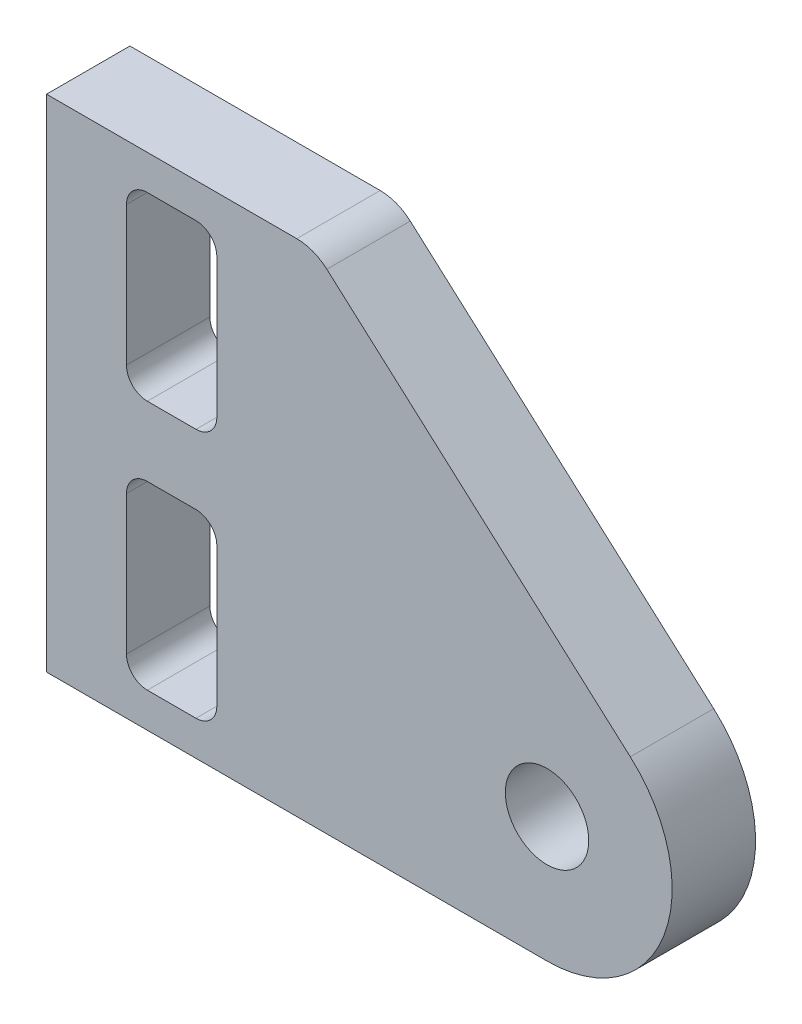
ISO-10303-21;
HEADER;
FILE_DESCRIPTION(('STEP AP214'),'2;1');
FILE_NAME('part.step','',(''),(''),'','','');
FILE_SCHEMA(('AUTOMOTIVE_DESIGN { 1 0 10303 214 1 1 1 1 }'));
ENDSEC;
DATA;
#1=APPLICATION_CONTEXT('core data for automotive mechanical design processes');
#2=APPLICATION_PROTOCOL_DEFINITION('international standard','automotive_design',2000,#1);
#3=PRODUCT_CONTEXT('',#1,'mechanical');
#4=PRODUCT('Part','Part','',(#3));
#5=PRODUCT_RELATED_PRODUCT_CATEGORY('part','',(#4));
#6=PRODUCT_DEFINITION_FORMATION('','',#4);
#7=PRODUCT_DEFINITION_CONTEXT('part definition',#1,'design');
#8=PRODUCT_DEFINITION('design','',#6,#7);
#9=PRODUCT_DEFINITION_SHAPE('','',#8);
#10=(LENGTH_UNIT() NAMED_UNIT(*) SI_UNIT(.MILLI.,.METRE.));
#11=(NAMED_UNIT(*) PLANE_ANGLE_UNIT() SI_UNIT($,.RADIAN.));
#12=(NAMED_UNIT(*) SI_UNIT($,.STERADIAN.) SOLID_ANGLE_UNIT());
#13=UNCERTAINTY_MEASURE_WITH_UNIT(LENGTH_MEASURE(1.E-05),#10,'distance_accuracy_value','');
#14=(GEOMETRIC_REPRESENTATION_CONTEXT(3) GLOBAL_UNCERTAINTY_ASSIGNED_CONTEXT((#13)) GLOBAL_UNIT_ASSIGNED_CONTEXT((#10,
#11,#12)) REPRESENTATION_CONTEXT('',''));
#15=CARTESIAN_POINT('',(0.,0.,0.));
#16=DIRECTION('',(0.,0.,1.));
#17=DIRECTION('',(1.,0.,0.));
#18=AXIS2_PLACEMENT_3D('',#15,#16,#17);
#19=CARTESIAN_POINT('',(201.097853309265,269.1465473352,3.));
#20=DIRECTION('',(0.,0.,1.));
#21=DIRECTION('',(1.,0.,0.));
#22=AXIS2_PLACEMENT_3D('',#19,#20,#21);
#23=PLANE('',#22);
#24=DIRECTION('',(1.,0.,0.));
#25=VECTOR('',#24,1.);
#26=CARTESIAN_POINT('',(186.7228533093,265.8965473352,3.));
#27=LINE('',#26,#25);
#28=CARTESIAN_POINT('',(186.7228533093,265.8965473352,3.));
#29=VERTEX_POINT('',#28);
#30=CARTESIAN_POINT('',(188.4728533093,265.8965473352,3.));
#31=VERTEX_POINT('',#30);
#32=EDGE_CURVE('E249',#29,#31,#27,.T.);
#33=ORIENTED_EDGE('',*,*,#32,.F.);
#34=CARTESIAN_POINT('',(186.7228533093,266.6465473352,3.));
#35=DIRECTION('',(0.,0.,1.));
#36=DIRECTION('',(1.,0.,0.));
#37=AXIS2_PLACEMENT_3D('',#34,#35,#36);
#38=CIRCLE('',#37,0.749999999999987);
#39=CARTESIAN_POINT('',(185.9728533093,266.6465473352,3.));
#40=VERTEX_POINT('',#39);
#41=EDGE_CURVE('E247',#40,#29,#38,.T.);
#42=ORIENTED_EDGE('',*,*,#41,.F.);
#43=DIRECTION('',(0.,-1.,0.));
#44=VECTOR('',#43,1.);
#45=CARTESIAN_POINT('',(185.9728533093,271.6465473352,3.));
#46=LINE('',#45,#44);
#47=CARTESIAN_POINT('',(185.9728533093,271.6465473352,3.));
#48=VERTEX_POINT('',#47);
#49=EDGE_CURVE('E263',#48,#40,#46,.T.);
#50=ORIENTED_EDGE('',*,*,#49,.F.);
#51=CARTESIAN_POINT('',(186.7228533093,271.6465473352,3.));
#52=DIRECTION('',(0.,0.,1.));
#53=DIRECTION('',(1.,0.,0.));
#54=AXIS2_PLACEMENT_3D('',#51,#52,#53);
#55=CIRCLE('',#54,0.750000000000015);
#56=CARTESIAN_POINT('',(186.7228533093,272.3965473352,3.));
#57=VERTEX_POINT('',#56);
#58=EDGE_CURVE('E260',#57,#48,#55,.T.);
#59=ORIENTED_EDGE('',*,*,#58,.F.);
#60=DIRECTION('',(-1.,0.,0.));
#61=VECTOR('',#60,1.);
#62=CARTESIAN_POINT('',(188.4728533093,272.3965473352,3.));
#63=LINE('',#62,#61);
#64=CARTESIAN_POINT('',(188.4728533093,272.3965473352,3.));
#65=VERTEX_POINT('',#64);
#66=EDGE_CURVE('E258',#65,#57,#63,.T.);
#67=ORIENTED_EDGE('',*,*,#66,.F.);
#68=CARTESIAN_POINT('',(188.4728533093,271.6465473352,3.));
#69=DIRECTION('',(0.,0.,1.));
#70=DIRECTION('',(1.,0.,0.));
#71=AXIS2_PLACEMENT_3D('',#68,#69,#70);
#72=CIRCLE('',#71,0.750000000000015);
#73=CARTESIAN_POINT('',(189.2228533093,271.6465473352,3.));
#74=VERTEX_POINT('',#73);
#75=EDGE_CURVE('E256',#74,#65,#72,.T.);
#76=ORIENTED_EDGE('',*,*,#75,.F.);
#77=DIRECTION('',(0.,1.,0.));
#78=VECTOR('',#77,1.);
#79=CARTESIAN_POINT('',(189.2228533093,266.6465473352,3.));
#80=LINE('',#79,#78);
#81=CARTESIAN_POINT('',(189.2228533093,266.6465473352,3.));
#82=VERTEX_POINT('',#81);
#83=EDGE_CURVE('E254',#82,#74,#80,.T.);
#84=ORIENTED_EDGE('',*,*,#83,.F.);
#85=CARTESIAN_POINT('',(188.4728533093,266.6465473352,3.));
#86=DIRECTION('',(0.,0.,1.));
#87=DIRECTION('',(1.,0.,0.));
#88=AXIS2_PLACEMENT_3D('',#85,#86,#87);
#89=CIRCLE('',#88,0.749999999999987);
#90=EDGE_CURVE('E252',#31,#82,#89,.T.);
#91=ORIENTED_EDGE('',*,*,#90,.F.);
#92=EDGE_LOOP('',(#33,#42,#50,#59,#67,#76,#84,#91));
#93=FACE_BOUND('',#92,.T.);
#94=CARTESIAN_POINT('',(201.097853309265,269.1465473352,3.));
#95=DIRECTION('',(0.,0.,1.));
#96=DIRECTION('',(1.,0.,0.));
#97=AXIS2_PLACEMENT_3D('',#94,#95,#96);
#98=CIRCLE('',#97,4.49999999999994);
#99=CARTESIAN_POINT('',(201.0978533093,264.6465473352,3.));
#100=VERTEX_POINT('',#99);
#101=CARTESIAN_POINT('',(204.0923677008,272.5055477161,3.));
#102=VERTEX_POINT('',#101);
#103=EDGE_CURVE('E312',#100,#102,#98,.T.);
#104=ORIENTED_EDGE('',*,*,#103,.T.);
#105=DIRECTION('',(-0.746444529098559,0.665447642552614,0.));
#106=VECTOR('',#105,1.);
#107=CARTESIAN_POINT('',(193.1792057284,282.2345196949,3.));
#108=LINE('',#107,#106);
#109=CARTESIAN_POINT('',(193.1792057284,282.2345196949,3.));
#110=VERTEX_POINT('',#109);
#111=EDGE_CURVE('E315',#102,#110,#108,.T.);
#112=ORIENTED_EDGE('',*,*,#111,.T.);
#113=CARTESIAN_POINT('',(192.097853309156,281.0215473352,3.));
#114=DIRECTION('',(0.,0.,1.));
#115=DIRECTION('',(1.,0.,0.));
#116=AXIS2_PLACEMENT_3D('',#113,#114,#115);
#117=CIRCLE('',#116,1.62499999999999);
#118=CARTESIAN_POINT('',(192.0978533093,282.6465473352,3.));
#119=VERTEX_POINT('',#118);
#120=EDGE_CURVE('E318',#110,#119,#117,.T.);
#121=ORIENTED_EDGE('',*,*,#120,.T.);
#122=DIRECTION('',(-1.,0.,0.));
#123=VECTOR('',#122,1.);
#124=CARTESIAN_POINT('',(192.0978533093,282.6465473352,3.));
#125=LINE('',#124,#123);
#126=CARTESIAN_POINT('',(183.0978533093,282.6465473352,3.));
#127=VERTEX_POINT('',#126);
#128=EDGE_CURVE('E320',#119,#127,#125,.T.);
#129=ORIENTED_EDGE('',*,*,#128,.T.);
#130=DIRECTION('',(0.,-1.,0.));
#131=VECTOR('',#130,1.);
#132=CARTESIAN_POINT('',(183.0978533093,282.6465473352,3.));
#133=LINE('',#132,#131);
#134=CARTESIAN_POINT('',(183.0978533093,264.6465473352,3.));
#135=VERTEX_POINT('',#134);
#136=EDGE_CURVE('E322',#127,#135,#133,.T.);
#137=ORIENTED_EDGE('',*,*,#136,.T.);
#138=DIRECTION('',(1.,0.,0.));
#139=VECTOR('',#138,1.);
#140=CARTESIAN_POINT('',(201.0978533093,264.6465473352,3.));
#141=LINE('',#140,#139);
#142=EDGE_CURVE('E324',#135,#100,#141,.T.);
#143=ORIENTED_EDGE('',*,*,#142,.T.);
#144=EDGE_LOOP('',(#104,#112,#121,#129,#137,#143));
#145=FACE_BOUND('',#144,.T.);
#146=CARTESIAN_POINT('',(201.097853309265,269.1465473352,3.));
#147=DIRECTION('',(0.,0.,1.));
#148=DIRECTION('',(1.,0.,0.));
#149=AXIS2_PLACEMENT_3D('',#146,#147,#148);
#150=CIRCLE('',#149,1.50000000003547);
#151=CARTESIAN_POINT('',(202.5978533093,269.1465473352,3.));
#152=VERTEX_POINT('',#151);
#153=EDGE_CURVE('E306',#152,#152,#150,.T.);
#154=ORIENTED_EDGE('',*,*,#153,.F.);
#155=EDGE_LOOP('',(#154));
#156=FACE_BOUND('',#155,.T.);
#157=DIRECTION('',(1.,0.,0.));
#158=VECTOR('',#157,1.);
#159=CARTESIAN_POINT('',(186.7228533093,274.8959687639,3.));
#160=LINE('',#159,#158);
#161=CARTESIAN_POINT('',(186.7228533093,274.8959687639,3.));
#162=VERTEX_POINT('',#161);
#163=CARTESIAN_POINT('',(188.4728533093,274.8959687639,3.));
#164=VERTEX_POINT('',#163);
#165=EDGE_CURVE('E190',#162,#164,#160,.T.);
#166=ORIENTED_EDGE('',*,*,#165,.F.);
#167=CARTESIAN_POINT('',(186.7228533093,275.6459687639,3.));
#168=DIRECTION('',(0.,0.,1.));
#169=DIRECTION('',(1.,0.,0.));
#170=AXIS2_PLACEMENT_3D('',#167,#168,#169);
#171=CIRCLE('',#170,0.750000000000015);
#172=CARTESIAN_POINT('',(185.9728533093,275.6459687639,3.));
#173=VERTEX_POINT('',#172);
#174=EDGE_CURVE('E182',#173,#162,#171,.T.);
#175=ORIENTED_EDGE('',*,*,#174,.F.);
#176=DIRECTION('',(0.,-1.,0.));
#177=VECTOR('',#176,1.);
#178=CARTESIAN_POINT('',(185.9728533093,280.6459687639,3.));
#179=LINE('',#178,#177);
#180=CARTESIAN_POINT('',(185.9728533093,280.6459687639,3.));
#181=VERTEX_POINT('',#180);
#182=EDGE_CURVE('E215',#181,#173,#179,.T.);
#183=ORIENTED_EDGE('',*,*,#182,.F.);
#184=CARTESIAN_POINT('',(186.7228533093,280.6459687639,3.));
#185=DIRECTION('',(0.,0.,1.));
#186=DIRECTION('',(1.,0.,0.));
#187=AXIS2_PLACEMENT_3D('',#184,#185,#186);
#188=CIRCLE('',#187,0.750000000000015);
#189=CARTESIAN_POINT('',(186.7228533093,281.3959687639,3.));
#190=VERTEX_POINT('',#189);
#191=EDGE_CURVE('E213',#190,#181,#188,.T.);
#192=ORIENTED_EDGE('',*,*,#191,.F.);
#193=DIRECTION('',(-1.,0.,0.));
#194=VECTOR('',#193,1.);
#195=CARTESIAN_POINT('',(188.4728533093,281.3959687639,3.));
#196=LINE('',#195,#194);
#197=CARTESIAN_POINT('',(188.4728533093,281.3959687639,3.));
#198=VERTEX_POINT('',#197);
#199=EDGE_CURVE('E211',#198,#190,#196,.T.);
#200=ORIENTED_EDGE('',*,*,#199,.F.);
#201=CARTESIAN_POINT('',(188.4728533093,280.6459687639,3.));
#202=DIRECTION('',(0.,0.,1.));
#203=DIRECTION('',(1.,0.,0.));
#204=AXIS2_PLACEMENT_3D('',#201,#202,#203);
#205=CIRCLE('',#204,0.750000000000015);
#206=CARTESIAN_POINT('',(189.2228533093,280.6459687639,3.));
#207=VERTEX_POINT('',#206);
#208=EDGE_CURVE('E209',#207,#198,#205,.T.);
#209=ORIENTED_EDGE('',*,*,#208,.F.);
#210=DIRECTION('',(0.,1.,0.));
#211=VECTOR('',#210,1.);
#212=CARTESIAN_POINT('',(189.2228533093,275.6459687639,3.));
#213=LINE('',#212,#211);
#214=CARTESIAN_POINT('',(189.2228533093,275.6459687639,3.));
#215=VERTEX_POINT('',#214);
#216=EDGE_CURVE('E205',#215,#207,#213,.T.);
#217=ORIENTED_EDGE('',*,*,#216,.F.);
#218=CARTESIAN_POINT('',(188.4728533093,275.6459687639,3.));
#219=DIRECTION('',(0.,0.,1.));
#220=DIRECTION('',(1.,0.,0.));
#221=AXIS2_PLACEMENT_3D('',#218,#219,#220);
#222=CIRCLE('',#221,0.750000000000015);
#223=EDGE_CURVE('E203',#164,#215,#222,.T.);
#224=ORIENTED_EDGE('',*,*,#223,.F.);
#225=EDGE_LOOP('',(#166,#175,#183,#192,#200,#209,#217,#224));
#226=FACE_BOUND('',#225,.T.);
#227=ADVANCED_FACE('F33',(#93,#145,#156,#226),#23,.T.);
#228=CARTESIAN_POINT('',(201.097853309265,269.1465473352,0.));
#229=DIRECTION('',(0.,0.,1.));
#230=DIRECTION('',(1.,0.,0.));
#231=AXIS2_PLACEMENT_3D('',#228,#229,#230);
#232=PLANE('',#231);
#233=CARTESIAN_POINT('',(186.7228533093,266.6465473352,0.));
#234=DIRECTION('',(0.,0.,1.));
#235=DIRECTION('',(1.,0.,0.));
#236=AXIS2_PLACEMENT_3D('',#233,#234,#235);
#237=CIRCLE('',#236,0.749999999999987);
#238=CARTESIAN_POINT('',(185.9728533093,266.6465473352,0.));
#239=VERTEX_POINT('',#238);
#240=CARTESIAN_POINT('',(186.7228533093,265.8965473352,0.));
#241=VERTEX_POINT('',#240);
#242=EDGE_CURVE('E198',#239,#241,#237,.T.);
#243=ORIENTED_EDGE('',*,*,#242,.T.);
#244=DIRECTION('',(1.,0.,0.));
#245=VECTOR('',#244,1.);
#246=CARTESIAN_POINT('',(186.7228533093,265.8965473352,0.));
#247=LINE('',#246,#245);
#248=CARTESIAN_POINT('',(188.4728533093,265.8965473352,0.));
#249=VERTEX_POINT('',#248);
#250=EDGE_CURVE('E268',#241,#249,#247,.T.);
#251=ORIENTED_EDGE('',*,*,#250,.T.);
#252=CARTESIAN_POINT('',(188.4728533093,266.6465473352,0.));
#253=DIRECTION('',(0.,0.,1.));
#254=DIRECTION('',(1.,0.,0.));
#255=AXIS2_PLACEMENT_3D('',#252,#253,#254);
#256=CIRCLE('',#255,0.749999999999987);
#257=CARTESIAN_POINT('',(189.2228533093,266.6465473352,0.));
#258=VERTEX_POINT('',#257);
#259=EDGE_CURVE('E271',#249,#258,#256,.T.);
#260=ORIENTED_EDGE('',*,*,#259,.T.);
#261=DIRECTION('',(0.,1.,0.));
#262=VECTOR('',#261,1.);
#263=CARTESIAN_POINT('',(189.2228533093,266.6465473352,0.));
#264=LINE('',#263,#262);
#265=CARTESIAN_POINT('',(189.2228533093,271.6465473352,0.));
#266=VERTEX_POINT('',#265);
#267=EDGE_CURVE('E274',#258,#266,#264,.T.);
#268=ORIENTED_EDGE('',*,*,#267,.T.);
#269=CARTESIAN_POINT('',(188.4728533093,271.6465473352,0.));
#270=DIRECTION('',(0.,0.,1.));
#271=DIRECTION('',(1.,0.,0.));
#272=AXIS2_PLACEMENT_3D('',#269,#270,#271);
#273=CIRCLE('',#272,0.750000000000015);
#274=CARTESIAN_POINT('',(188.4728533093,272.3965473352,0.));
#275=VERTEX_POINT('',#274);
#276=EDGE_CURVE('E277',#266,#275,#273,.T.);
#277=ORIENTED_EDGE('',*,*,#276,.T.);
#278=DIRECTION('',(-1.,0.,0.));
#279=VECTOR('',#278,1.);
#280=CARTESIAN_POINT('',(188.4728533093,272.3965473352,0.));
#281=LINE('',#280,#279);
#282=CARTESIAN_POINT('',(186.7228533093,272.3965473352,0.));
#283=VERTEX_POINT('',#282);
#284=EDGE_CURVE('E280',#275,#283,#281,.T.);
#285=ORIENTED_EDGE('',*,*,#284,.T.);
#286=CARTESIAN_POINT('',(186.7228533093,271.6465473352,0.));
#287=DIRECTION('',(0.,0.,1.));
#288=DIRECTION('',(1.,0.,0.));
#289=AXIS2_PLACEMENT_3D('',#286,#287,#288);
#290=CIRCLE('',#289,0.750000000000015);
#291=CARTESIAN_POINT('',(185.9728533093,271.6465473352,0.));
#292=VERTEX_POINT('',#291);
#293=EDGE_CURVE('E283',#283,#292,#290,.T.);
#294=ORIENTED_EDGE('',*,*,#293,.T.);
#295=DIRECTION('',(0.,-1.,0.));
#296=VECTOR('',#295,1.);
#297=CARTESIAN_POINT('',(185.9728533093,271.6465473352,0.));
#298=LINE('',#297,#296);
#299=EDGE_CURVE('E250',#292,#239,#298,.T.);
#300=ORIENTED_EDGE('',*,*,#299,.T.);
#301=EDGE_LOOP('',(#243,#251,#260,#268,#277,#285,#294,#300));
#302=FACE_BOUND('',#301,.T.);
#303=CARTESIAN_POINT('',(201.097853309265,269.1465473352,0.));
#304=DIRECTION('',(0.,0.,1.));
#305=DIRECTION('',(1.,0.,0.));
#306=AXIS2_PLACEMENT_3D('',#303,#304,#305);
#307=CIRCLE('',#306,4.49999999999994);
#308=CARTESIAN_POINT('',(201.0978533093,264.6465473352,0.));
#309=VERTEX_POINT('',#308);
#310=CARTESIAN_POINT('',(204.0923677008,272.5055477161,0.));
#311=VERTEX_POINT('',#310);
#312=EDGE_CURVE('E309',#309,#311,#307,.T.);
#313=ORIENTED_EDGE('',*,*,#312,.F.);
#314=DIRECTION('',(1.,0.,0.));
#315=VECTOR('',#314,1.);
#316=CARTESIAN_POINT('',(201.0978533093,264.6465473352,0.));
#317=LINE('',#316,#315);
#318=CARTESIAN_POINT('',(183.0978533093,264.6465473352,0.));
#319=VERTEX_POINT('',#318);
#320=EDGE_CURVE('E316',#319,#309,#317,.T.);
#321=ORIENTED_EDGE('',*,*,#320,.F.);
#322=DIRECTION('',(0.,-1.,0.));
#323=VECTOR('',#322,1.);
#324=CARTESIAN_POINT('',(183.0978533093,282.6465473352,0.));
#325=LINE('',#324,#323);
#326=CARTESIAN_POINT('',(183.0978533093,282.6465473352,0.));
#327=VERTEX_POINT('',#326);
#328=EDGE_CURVE('E335',#327,#319,#325,.T.);
#329=ORIENTED_EDGE('',*,*,#328,.F.);
#330=DIRECTION('',(-1.,0.,0.));
#331=VECTOR('',#330,1.);
#332=CARTESIAN_POINT('',(192.0978533093,282.6465473352,0.));
#333=LINE('',#332,#331);
#334=CARTESIAN_POINT('',(192.0978533093,282.6465473352,0.));
#335=VERTEX_POINT('',#334);
#336=EDGE_CURVE('E333',#335,#327,#333,.T.);
#337=ORIENTED_EDGE('',*,*,#336,.F.);
#338=CARTESIAN_POINT('',(192.097853309156,281.0215473352,0.));
#339=DIRECTION('',(0.,0.,1.));
#340=DIRECTION('',(1.,0.,0.));
#341=AXIS2_PLACEMENT_3D('',#338,#339,#340);
#342=CIRCLE('',#341,1.62499999999999);
#343=CARTESIAN_POINT('',(193.1792057284,282.2345196949,0.));
#344=VERTEX_POINT('',#343);
#345=EDGE_CURVE('E331',#344,#335,#342,.T.);
#346=ORIENTED_EDGE('',*,*,#345,.F.);
#347=DIRECTION('',(-0.746444529098559,0.665447642552614,0.));
#348=VECTOR('',#347,1.);
#349=CARTESIAN_POINT('',(193.1792057284,282.2345196949,0.));
#350=LINE('',#349,#348);
#351=EDGE_CURVE('E329',#311,#344,#350,.T.);
#352=ORIENTED_EDGE('',*,*,#351,.F.);
#353=EDGE_LOOP('',(#313,#321,#329,#337,#346,#352));
#354=FACE_BOUND('',#353,.T.);
#355=CARTESIAN_POINT('',(201.097853309265,269.1465473352,0.));
#356=DIRECTION('',(0.,0.,1.));
#357=DIRECTION('',(1.,0.,0.));
#358=AXIS2_PLACEMENT_3D('',#355,#356,#357);
#359=CIRCLE('',#358,1.50000000003547);
#360=CARTESIAN_POINT('',(202.5978533093,269.1465473352,0.));
#361=VERTEX_POINT('',#360);
#362=EDGE_CURVE('E305',#361,#361,#359,.T.);
#363=ORIENTED_EDGE('',*,*,#362,.T.);
#364=EDGE_LOOP('',(#363));
#365=FACE_BOUND('',#364,.T.);
#366=CARTESIAN_POINT('',(186.7228533093,275.6459687639,0.));
#367=DIRECTION('',(0.,0.,1.));
#368=DIRECTION('',(1.,0.,0.));
#369=AXIS2_PLACEMENT_3D('',#366,#367,#368);
#370=CIRCLE('',#369,0.750000000000015);
#371=CARTESIAN_POINT('',(185.9728533093,275.6459687639,0.));
#372=VERTEX_POINT('',#371);
#373=CARTESIAN_POINT('',(186.7228533093,274.8959687639,0.));
#374=VERTEX_POINT('',#373);
#375=EDGE_CURVE('E56',#372,#374,#370,.T.);
#376=ORIENTED_EDGE('',*,*,#375,.T.);
#377=DIRECTION('',(1.,0.,0.));
#378=VECTOR('',#377,1.);
#379=CARTESIAN_POINT('',(186.7228533093,274.8959687639,0.));
#380=LINE('',#379,#378);
#381=CARTESIAN_POINT('',(188.4728533093,274.8959687639,0.));
#382=VERTEX_POINT('',#381);
#383=EDGE_CURVE('E197',#374,#382,#380,.T.);
#384=ORIENTED_EDGE('',*,*,#383,.T.);
#385=CARTESIAN_POINT('',(188.4728533093,275.6459687639,0.));
#386=DIRECTION('',(0.,0.,1.));
#387=DIRECTION('',(1.,0.,0.));
#388=AXIS2_PLACEMENT_3D('',#385,#386,#387);
#389=CIRCLE('',#388,0.750000000000015);
#390=CARTESIAN_POINT('',(189.2228533093,275.6459687639,0.));
#391=VERTEX_POINT('',#390);
#392=EDGE_CURVE('E219',#382,#391,#389,.T.);
#393=ORIENTED_EDGE('',*,*,#392,.T.);
#394=DIRECTION('',(0.,1.,0.));
#395=VECTOR('',#394,1.);
#396=CARTESIAN_POINT('',(189.2228533093,275.6459687639,0.));
#397=LINE('',#396,#395);
#398=CARTESIAN_POINT('',(189.2228533093,280.6459687639,0.));
#399=VERTEX_POINT('',#398);
#400=EDGE_CURVE('E222',#391,#399,#397,.T.);
#401=ORIENTED_EDGE('',*,*,#400,.T.);
#402=CARTESIAN_POINT('',(188.4728533093,280.6459687639,0.));
#403=DIRECTION('',(0.,0.,1.));
#404=DIRECTION('',(1.,0.,0.));
#405=AXIS2_PLACEMENT_3D('',#402,#403,#404);
#406=CIRCLE('',#405,0.750000000000015);
#407=CARTESIAN_POINT('',(188.4728533093,281.3959687639,0.));
#408=VERTEX_POINT('',#407);
#409=EDGE_CURVE('E225',#399,#408,#406,.T.);
#410=ORIENTED_EDGE('',*,*,#409,.T.);
#411=DIRECTION('',(-1.,0.,0.));
#412=VECTOR('',#411,1.);
#413=CARTESIAN_POINT('',(188.4728533093,281.3959687639,0.));
#414=LINE('',#413,#412);
#415=CARTESIAN_POINT('',(186.7228533093,281.3959687639,0.));
#416=VERTEX_POINT('',#415);
#417=EDGE_CURVE('E228',#408,#416,#414,.T.);
#418=ORIENTED_EDGE('',*,*,#417,.T.);
#419=CARTESIAN_POINT('',(186.7228533093,280.6459687639,0.));
#420=DIRECTION('',(0.,0.,1.));
#421=DIRECTION('',(1.,0.,0.));
#422=AXIS2_PLACEMENT_3D('',#419,#420,#421);
#423=CIRCLE('',#422,0.750000000000015);
#424=CARTESIAN_POINT('',(185.9728533093,280.6459687639,0.));
#425=VERTEX_POINT('',#424);
#426=EDGE_CURVE('E231',#416,#425,#423,.T.);
#427=ORIENTED_EDGE('',*,*,#426,.T.);
#428=DIRECTION('',(0.,-1.,0.));
#429=VECTOR('',#428,1.);
#430=CARTESIAN_POINT('',(185.9728533093,280.6459687639,0.));
#431=LINE('',#430,#429);
#432=EDGE_CURVE('E191',#425,#372,#431,.T.);
#433=ORIENTED_EDGE('',*,*,#432,.T.);
#434=EDGE_LOOP('',(#376,#384,#393,#401,#410,#418,#427,#433));
#435=FACE_BOUND('',#434,.T.);
#436=ADVANCED_FACE('F359',(#302,#354,#365,#435),#232,.F.);
#437=CARTESIAN_POINT('',(201.097853309265,269.1465473352,3.));
#438=DIRECTION('',(0.,0.,-1.));
#439=DIRECTION('',(-1.,0.,0.));
#440=AXIS2_PLACEMENT_3D('',#437,#438,#439);
#441=CYLINDRICAL_SURFACE('',#440,4.49999999999994);
#442=ORIENTED_EDGE('',*,*,#312,.T.);
#443=DIRECTION('',(0.,0.,-1.));
#444=VECTOR('',#443,1.);
#445=CARTESIAN_POINT('',(204.0923677008,272.5055477161,3.));
#446=LINE('',#445,#444);
#447=EDGE_CURVE('E11',#102,#311,#446,.T.);
#448=ORIENTED_EDGE('',*,*,#447,.F.);
#449=ORIENTED_EDGE('',*,*,#103,.F.);
#450=DIRECTION('',(0.,0.,-1.));
#451=VECTOR('',#450,1.);
#452=CARTESIAN_POINT('',(201.0978533093,264.6465473352,3.));
#453=LINE('',#452,#451);
#454=EDGE_CURVE('E326',#100,#309,#453,.T.);
#455=ORIENTED_EDGE('',*,*,#454,.T.);
#456=EDGE_LOOP('',(#442,#448,#449,#455));
#457=FACE_BOUND('',#456,.T.);
#458=ADVANCED_FACE('F35',(#457),#441,.T.);
#459=CARTESIAN_POINT('',(193.1792057284,282.2345196949,3.));
#460=DIRECTION('',(-0.665447642552613,-0.746444529098559,0.));
#461=DIRECTION('',(0.746444529098559,-0.665447642552614,0.));
#462=AXIS2_PLACEMENT_3D('',#459,#460,#461);
#463=PLANE('',#462);
#464=ORIENTED_EDGE('',*,*,#351,.T.);
#465=DIRECTION('',(0.,0.,-1.));
#466=VECTOR('',#465,1.);
#467=CARTESIAN_POINT('',(193.1792057284,282.2345196949,3.));
#468=LINE('',#467,#466);
#469=EDGE_CURVE('E41',#110,#344,#468,.T.);
#470=ORIENTED_EDGE('',*,*,#469,.F.);
#471=ORIENTED_EDGE('',*,*,#111,.F.);
#472=ORIENTED_EDGE('',*,*,#447,.T.);
#473=EDGE_LOOP('',(#464,#470,#471,#472));
#474=FACE_BOUND('',#473,.T.);
#475=ADVANCED_FACE('F377',(#474),#463,.F.);
#476=CARTESIAN_POINT('',(192.097853309156,281.0215473352,3.));
#477=DIRECTION('',(0.,0.,-1.));
#478=DIRECTION('',(-1.,0.,0.));
#479=AXIS2_PLACEMENT_3D('',#476,#477,#478);
#480=CYLINDRICAL_SURFACE('',#479,1.62499999999999);
#481=ORIENTED_EDGE('',*,*,#345,.T.);
#482=DIRECTION('',(0.,0.,-1.));
#483=VECTOR('',#482,1.);
#484=CARTESIAN_POINT('',(192.0978533093,282.6465473352,3.));
#485=LINE('',#484,#483);
#486=EDGE_CURVE('E346',#119,#335,#485,.T.);
#487=ORIENTED_EDGE('',*,*,#486,.F.);
#488=ORIENTED_EDGE('',*,*,#120,.F.);
#489=ORIENTED_EDGE('',*,*,#469,.T.);
#490=EDGE_LOOP('',(#481,#487,#488,#489));
#491=FACE_BOUND('',#490,.T.);
#492=ADVANCED_FACE('F353',(#491),#480,.T.);
#493=CARTESIAN_POINT('',(192.0978533093,282.6465473352,3.));
#494=DIRECTION('',(0.,-1.,0.));
#495=DIRECTION('',(0.,0.,-1.));
#496=AXIS2_PLACEMENT_3D('',#493,#494,#495);
#497=PLANE('',#496);
#498=ORIENTED_EDGE('',*,*,#336,.T.);
#499=DIRECTION('',(0.,0.,-1.));
#500=VECTOR('',#499,1.);
#501=CARTESIAN_POINT('',(183.0978533093,282.6465473352,3.));
#502=LINE('',#501,#500);
#503=EDGE_CURVE('E343',#127,#327,#502,.T.);
#504=ORIENTED_EDGE('',*,*,#503,.F.);
#505=ORIENTED_EDGE('',*,*,#128,.F.);
#506=ORIENTED_EDGE('',*,*,#486,.T.);
#507=EDGE_LOOP('',(#498,#504,#505,#506));
#508=FACE_BOUND('',#507,.T.);
#509=ADVANCED_FACE('F365',(#508),#497,.F.);
#510=CARTESIAN_POINT('',(183.0978533093,282.6465473352,3.));
#511=DIRECTION('',(1.,0.,0.));
#512=DIRECTION('',(0.,0.,-1.));
#513=AXIS2_PLACEMENT_3D('',#510,#511,#512);
#514=PLANE('',#513);
#515=ORIENTED_EDGE('',*,*,#328,.T.);
#516=DIRECTION('',(0.,0.,-1.));
#517=VECTOR('',#516,1.);
#518=CARTESIAN_POINT('',(183.0978533093,264.6465473352,3.));
#519=LINE('',#518,#517);
#520=EDGE_CURVE('E340',#135,#319,#519,.T.);
#521=ORIENTED_EDGE('',*,*,#520,.F.);
#522=ORIENTED_EDGE('',*,*,#136,.F.);
#523=ORIENTED_EDGE('',*,*,#503,.T.);
#524=EDGE_LOOP('',(#515,#521,#522,#523));
#525=FACE_BOUND('',#524,.T.);
#526=ADVANCED_FACE('F369',(#525),#514,.F.);
#527=CARTESIAN_POINT('',(201.0978533093,264.6465473352,3.));
#528=DIRECTION('',(0.,1.,0.));
#529=DIRECTION('',(0.,0.,1.));
#530=AXIS2_PLACEMENT_3D('',#527,#528,#529);
#531=PLANE('',#530);
#532=ORIENTED_EDGE('',*,*,#320,.T.);
#533=ORIENTED_EDGE('',*,*,#454,.F.);
#534=ORIENTED_EDGE('',*,*,#142,.F.);
#535=ORIENTED_EDGE('',*,*,#520,.T.);
#536=EDGE_LOOP('',(#532,#533,#534,#535));
#537=FACE_BOUND('',#536,.T.);
#538=ADVANCED_FACE('F380',(#537),#531,.F.);
#539=CARTESIAN_POINT('',(201.097853309265,269.1465473352,3.));
#540=DIRECTION('',(0.,0.,-1.));
#541=DIRECTION('',(-1.,0.,0.));
#542=AXIS2_PLACEMENT_3D('',#539,#540,#541);
#543=CYLINDRICAL_SURFACE('',#542,1.50000000003547);
#544=ORIENTED_EDGE('',*,*,#153,.T.);
#545=EDGE_LOOP('',(#544));
#546=FACE_BOUND('',#545,.T.);
#547=ORIENTED_EDGE('',*,*,#362,.F.);
#548=EDGE_LOOP('',(#547));
#549=FACE_BOUND('',#548,.T.);
#550=ADVANCED_FACE('F382',(#546,#549),#543,.F.);
#551=CARTESIAN_POINT('',(186.7228533093,266.6465473352,3.));
#552=DIRECTION('',(0.,0.,-1.));
#553=DIRECTION('',(-1.,0.,0.));
#554=AXIS2_PLACEMENT_3D('',#551,#552,#553);
#555=CYLINDRICAL_SURFACE('',#554,0.749999999999987);
#556=ORIENTED_EDGE('',*,*,#242,.F.);
#557=DIRECTION('',(0.,0.,-1.));
#558=VECTOR('',#557,1.);
#559=CARTESIAN_POINT('',(185.9728533093,266.6465473352,3.));
#560=LINE('',#559,#558);
#561=EDGE_CURVE('E265',#40,#239,#560,.T.);
#562=ORIENTED_EDGE('',*,*,#561,.F.);
#563=ORIENTED_EDGE('',*,*,#41,.T.);
#564=DIRECTION('',(0.,0.,-1.));
#565=VECTOR('',#564,1.);
#566=CARTESIAN_POINT('',(186.7228533093,265.8965473352,3.));
#567=LINE('',#566,#565);
#568=EDGE_CURVE('E302',#29,#241,#567,.T.);
#569=ORIENTED_EDGE('',*,*,#568,.T.);
#570=EDGE_LOOP('',(#556,#562,#563,#569));
#571=FACE_BOUND('',#570,.T.);
#572=ADVANCED_FACE('F388',(#571),#555,.F.);
#573=CARTESIAN_POINT('',(186.7228533093,265.8965473352,3.));
#574=DIRECTION('',(0.,1.,0.));
#575=DIRECTION('',(0.,0.,1.));
#576=AXIS2_PLACEMENT_3D('',#573,#574,#575);
#577=PLANE('',#576);
#578=ORIENTED_EDGE('',*,*,#250,.F.);
#579=ORIENTED_EDGE('',*,*,#568,.F.);
#580=ORIENTED_EDGE('',*,*,#32,.T.);
#581=DIRECTION('',(0.,0.,-1.));
#582=VECTOR('',#581,1.);
#583=CARTESIAN_POINT('',(188.4728533093,265.8965473352,3.));
#584=LINE('',#583,#582);
#585=EDGE_CURVE('E300',#31,#249,#584,.T.);
#586=ORIENTED_EDGE('',*,*,#585,.T.);
#587=EDGE_LOOP('',(#578,#579,#580,#586));
#588=FACE_BOUND('',#587,.T.);
#589=ADVANCED_FACE('F404',(#588),#577,.T.);
#590=CARTESIAN_POINT('',(188.4728533093,266.6465473352,3.));
#591=DIRECTION('',(0.,0.,-1.));
#592=DIRECTION('',(-1.,0.,0.));
#593=AXIS2_PLACEMENT_3D('',#590,#591,#592);
#594=CYLINDRICAL_SURFACE('',#593,0.749999999999987);
#595=ORIENTED_EDGE('',*,*,#259,.F.);
#596=ORIENTED_EDGE('',*,*,#585,.F.);
#597=ORIENTED_EDGE('',*,*,#90,.T.);
#598=DIRECTION('',(0.,0.,-1.));
#599=VECTOR('',#598,1.);
#600=CARTESIAN_POINT('',(189.2228533093,266.6465473352,3.));
#601=LINE('',#600,#599);
#602=EDGE_CURVE('E298',#82,#258,#601,.T.);
#603=ORIENTED_EDGE('',*,*,#602,.T.);
#604=EDGE_LOOP('',(#595,#596,#597,#603));
#605=FACE_BOUND('',#604,.T.);
#606=ADVANCED_FACE('F408',(#605),#594,.F.);
#607=CARTESIAN_POINT('',(189.2228533093,266.6465473352,3.));
#608=DIRECTION('',(-1.,0.,0.));
#609=DIRECTION('',(0.,0.,1.));
#610=AXIS2_PLACEMENT_3D('',#607,#608,#609);
#611=PLANE('',#610);
#612=ORIENTED_EDGE('',*,*,#267,.F.);
#613=ORIENTED_EDGE('',*,*,#602,.F.);
#614=ORIENTED_EDGE('',*,*,#83,.T.);
#615=DIRECTION('',(0.,0.,-1.));
#616=VECTOR('',#615,1.);
#617=CARTESIAN_POINT('',(189.2228533093,271.6465473352,3.));
#618=LINE('',#617,#616);
#619=EDGE_CURVE('E296',#74,#266,#618,.T.);
#620=ORIENTED_EDGE('',*,*,#619,.T.);
#621=EDGE_LOOP('',(#612,#613,#614,#620));
#622=FACE_BOUND('',#621,.T.);
#623=ADVANCED_FACE('F412',(#622),#611,.T.);
#624=CARTESIAN_POINT('',(188.4728533093,271.6465473352,3.));
#625=DIRECTION('',(0.,0.,-1.));
#626=DIRECTION('',(-1.,0.,0.));
#627=AXIS2_PLACEMENT_3D('',#624,#625,#626);
#628=CYLINDRICAL_SURFACE('',#627,0.750000000000015);
#629=ORIENTED_EDGE('',*,*,#276,.F.);
#630=ORIENTED_EDGE('',*,*,#619,.F.);
#631=ORIENTED_EDGE('',*,*,#75,.T.);
#632=DIRECTION('',(0.,0.,-1.));
#633=VECTOR('',#632,1.);
#634=CARTESIAN_POINT('',(188.4728533093,272.3965473352,3.));
#635=LINE('',#634,#633);
#636=EDGE_CURVE('E294',#65,#275,#635,.T.);
#637=ORIENTED_EDGE('',*,*,#636,.T.);
#638=EDGE_LOOP('',(#629,#630,#631,#637));
#639=FACE_BOUND('',#638,.T.);
#640=ADVANCED_FACE('F416',(#639),#628,.F.);
#641=CARTESIAN_POINT('',(188.4728533093,272.3965473352,3.));
#642=DIRECTION('',(0.,-1.,0.));
#643=DIRECTION('',(0.,0.,-1.));
#644=AXIS2_PLACEMENT_3D('',#641,#642,#643);
#645=PLANE('',#644);
#646=ORIENTED_EDGE('',*,*,#284,.F.);
#647=ORIENTED_EDGE('',*,*,#636,.F.);
#648=ORIENTED_EDGE('',*,*,#66,.T.);
#649=DIRECTION('',(0.,0.,-1.));
#650=VECTOR('',#649,1.);
#651=CARTESIAN_POINT('',(186.7228533093,272.3965473352,3.));
#652=LINE('',#651,#650);
#653=EDGE_CURVE('E292',#57,#283,#652,.T.);
#654=ORIENTED_EDGE('',*,*,#653,.T.);
#655=EDGE_LOOP('',(#646,#647,#648,#654));
#656=FACE_BOUND('',#655,.T.);
#657=ADVANCED_FACE('F420',(#656),#645,.T.);
#658=CARTESIAN_POINT('',(186.7228533093,271.6465473352,3.));
#659=DIRECTION('',(0.,0.,-1.));
#660=DIRECTION('',(-1.,0.,0.));
#661=AXIS2_PLACEMENT_3D('',#658,#659,#660);
#662=CYLINDRICAL_SURFACE('',#661,0.750000000000015);
#663=ORIENTED_EDGE('',*,*,#293,.F.);
#664=ORIENTED_EDGE('',*,*,#653,.F.);
#665=ORIENTED_EDGE('',*,*,#58,.T.);
#666=DIRECTION('',(0.,0.,-1.));
#667=VECTOR('',#666,1.);
#668=CARTESIAN_POINT('',(185.9728533093,271.6465473352,3.));
#669=LINE('',#668,#667);
#670=EDGE_CURVE('E290',#48,#292,#669,.T.);
#671=ORIENTED_EDGE('',*,*,#670,.T.);
#672=EDGE_LOOP('',(#663,#664,#665,#671));
#673=FACE_BOUND('',#672,.T.);
#674=ADVANCED_FACE('F424',(#673),#662,.F.);
#675=CARTESIAN_POINT('',(185.9728533093,271.6465473352,3.));
#676=DIRECTION('',(1.,0.,0.));
#677=DIRECTION('',(0.,0.,-1.));
#678=AXIS2_PLACEMENT_3D('',#675,#676,#677);
#679=PLANE('',#678);
#680=ORIENTED_EDGE('',*,*,#299,.F.);
#681=ORIENTED_EDGE('',*,*,#670,.F.);
#682=ORIENTED_EDGE('',*,*,#49,.T.);
#683=ORIENTED_EDGE('',*,*,#561,.T.);
#684=EDGE_LOOP('',(#680,#681,#682,#683));
#685=FACE_BOUND('',#684,.T.);
#686=ADVANCED_FACE('F428',(#685),#679,.T.);
#687=CARTESIAN_POINT('',(186.7228533093,275.6459687639,3.));
#688=DIRECTION('',(0.,0.,-1.));
#689=DIRECTION('',(-1.,0.,0.));
#690=AXIS2_PLACEMENT_3D('',#687,#688,#689);
#691=CYLINDRICAL_SURFACE('',#690,0.750000000000015);
#692=ORIENTED_EDGE('',*,*,#375,.F.);
#693=DIRECTION('',(0.,0.,-1.));
#694=VECTOR('',#693,1.);
#695=CARTESIAN_POINT('',(185.9728533093,275.6459687639,3.));
#696=LINE('',#695,#694);
#697=EDGE_CURVE('E186',#173,#372,#696,.T.);
#698=ORIENTED_EDGE('',*,*,#697,.F.);
#699=ORIENTED_EDGE('',*,*,#174,.T.);
#700=DIRECTION('',(0.,0.,-1.));
#701=VECTOR('',#700,1.);
#702=CARTESIAN_POINT('',(186.7228533093,274.8959687639,3.));
#703=LINE('',#702,#701);
#704=EDGE_CURVE('E185',#162,#374,#703,.T.);
#705=ORIENTED_EDGE('',*,*,#704,.T.);
#706=EDGE_LOOP('',(#692,#698,#699,#705));
#707=FACE_BOUND('',#706,.T.);
#708=ADVANCED_FACE('F184',(#707),#691,.F.);
#709=CARTESIAN_POINT('',(186.7228533093,274.8959687639,3.));
#710=DIRECTION('',(0.,1.,0.));
#711=DIRECTION('',(0.,0.,1.));
#712=AXIS2_PLACEMENT_3D('',#709,#710,#711);
#713=PLANE('',#712);
#714=ORIENTED_EDGE('',*,*,#383,.F.);
#715=ORIENTED_EDGE('',*,*,#704,.F.);
#716=ORIENTED_EDGE('',*,*,#165,.T.);
#717=DIRECTION('',(0.,0.,-1.));
#718=VECTOR('',#717,1.);
#719=CARTESIAN_POINT('',(188.4728533093,274.8959687639,3.));
#720=LINE('',#719,#718);
#721=EDGE_CURVE('E199',#164,#382,#720,.T.);
#722=ORIENTED_EDGE('',*,*,#721,.T.);
#723=EDGE_LOOP('',(#714,#715,#716,#722));
#724=FACE_BOUND('',#723,.T.);
#725=ADVANCED_FACE('F194',(#724),#713,.T.);
#726=CARTESIAN_POINT('',(188.4728533093,275.6459687639,3.));
#727=DIRECTION('',(0.,0.,-1.));
#728=DIRECTION('',(-1.,0.,0.));
#729=AXIS2_PLACEMENT_3D('',#726,#727,#728);
#730=CYLINDRICAL_SURFACE('',#729,0.750000000000015);
#731=ORIENTED_EDGE('',*,*,#392,.F.);
#732=ORIENTED_EDGE('',*,*,#721,.F.);
#733=ORIENTED_EDGE('',*,*,#223,.T.);
#734=DIRECTION('',(0.,0.,-1.));
#735=VECTOR('',#734,1.);
#736=CARTESIAN_POINT('',(189.2228533093,275.6459687639,3.));
#737=LINE('',#736,#735);
#738=EDGE_CURVE('E244',#215,#391,#737,.T.);
#739=ORIENTED_EDGE('',*,*,#738,.T.);
#740=EDGE_LOOP('',(#731,#732,#733,#739));
#741=FACE_BOUND('',#740,.T.);
#742=ADVANCED_FACE('F437',(#741),#730,.F.);
#743=CARTESIAN_POINT('',(189.2228533093,275.6459687639,3.));
#744=DIRECTION('',(-1.,0.,0.));
#745=DIRECTION('',(0.,0.,1.));
#746=AXIS2_PLACEMENT_3D('',#743,#744,#745);
#747=PLANE('',#746);
#748=ORIENTED_EDGE('',*,*,#400,.F.);
#749=ORIENTED_EDGE('',*,*,#738,.F.);
#750=ORIENTED_EDGE('',*,*,#216,.T.);
#751=DIRECTION('',(0.,0.,-1.));
#752=VECTOR('',#751,1.);
#753=CARTESIAN_POINT('',(189.2228533093,280.6459687639,3.));
#754=LINE('',#753,#752);
#755=EDGE_CURVE('E242',#207,#399,#754,.T.);
#756=ORIENTED_EDGE('',*,*,#755,.T.);
#757=EDGE_LOOP('',(#748,#749,#750,#756));
#758=FACE_BOUND('',#757,.T.);
#759=ADVANCED_FACE('F440',(#758),#747,.T.);
#760=CARTESIAN_POINT('',(188.4728533093,280.6459687639,3.));
#761=DIRECTION('',(0.,0.,-1.));
#762=DIRECTION('',(-1.,0.,0.));
#763=AXIS2_PLACEMENT_3D('',#760,#761,#762);
#764=CYLINDRICAL_SURFACE('',#763,0.750000000000015);
#765=ORIENTED_EDGE('',*,*,#409,.F.);
#766=ORIENTED_EDGE('',*,*,#755,.F.);
#767=ORIENTED_EDGE('',*,*,#208,.T.);
#768=DIRECTION('',(0.,0.,-1.));
#769=VECTOR('',#768,1.);
#770=CARTESIAN_POINT('',(188.4728533093,281.3959687639,3.));
#771=LINE('',#770,#769);
#772=EDGE_CURVE('E240',#198,#408,#771,.T.);
#773=ORIENTED_EDGE('',*,*,#772,.T.);
#774=EDGE_LOOP('',(#765,#766,#767,#773));
#775=FACE_BOUND('',#774,.T.);
#776=ADVANCED_FACE('F444',(#775),#764,.F.);
#777=CARTESIAN_POINT('',(188.4728533093,281.3959687639,3.));
#778=DIRECTION('',(0.,-1.,0.));
#779=DIRECTION('',(0.,0.,-1.));
#780=AXIS2_PLACEMENT_3D('',#777,#778,#779);
#781=PLANE('',#780);
#782=ORIENTED_EDGE('',*,*,#417,.F.);
#783=ORIENTED_EDGE('',*,*,#772,.F.);
#784=ORIENTED_EDGE('',*,*,#199,.T.);
#785=DIRECTION('',(0.,0.,-1.));
#786=VECTOR('',#785,1.);
#787=CARTESIAN_POINT('',(186.7228533093,281.3959687639,3.));
#788=LINE('',#787,#786);
#789=EDGE_CURVE('E238',#190,#416,#788,.T.);
#790=ORIENTED_EDGE('',*,*,#789,.T.);
#791=EDGE_LOOP('',(#782,#783,#784,#790));
#792=FACE_BOUND('',#791,.T.);
#793=ADVANCED_FACE('F448',(#792),#781,.T.);
#794=CARTESIAN_POINT('',(186.7228533093,280.6459687639,3.));
#795=DIRECTION('',(0.,0.,-1.));
#796=DIRECTION('',(-1.,0.,0.));
#797=AXIS2_PLACEMENT_3D('',#794,#795,#796);
#798=CYLINDRICAL_SURFACE('',#797,0.750000000000015);
#799=ORIENTED_EDGE('',*,*,#426,.F.);
#800=ORIENTED_EDGE('',*,*,#789,.F.);
#801=ORIENTED_EDGE('',*,*,#191,.T.);
#802=DIRECTION('',(0.,0.,-1.));
#803=VECTOR('',#802,1.);
#804=CARTESIAN_POINT('',(185.9728533093,280.6459687639,3.));
#805=LINE('',#804,#803);
#806=EDGE_CURVE('E48',#181,#425,#805,.T.);
#807=ORIENTED_EDGE('',*,*,#806,.T.);
#808=EDGE_LOOP('',(#799,#800,#801,#807));
#809=FACE_BOUND('',#808,.T.);
#810=ADVANCED_FACE('F452',(#809),#798,.F.);
#811=CARTESIAN_POINT('',(185.9728533093,280.6459687639,3.));
#812=DIRECTION('',(1.,0.,0.));
#813=DIRECTION('',(0.,0.,-1.));
#814=AXIS2_PLACEMENT_3D('',#811,#812,#813);
#815=PLANE('',#814);
#816=ORIENTED_EDGE('',*,*,#432,.F.);
#817=ORIENTED_EDGE('',*,*,#806,.F.);
#818=ORIENTED_EDGE('',*,*,#182,.T.);
#819=ORIENTED_EDGE('',*,*,#697,.T.);
#820=EDGE_LOOP('',(#816,#817,#818,#819));
#821=FACE_BOUND('',#820,.T.);
#822=ADVANCED_FACE('F456',(#821),#815,.T.);
#823=CLOSED_SHELL('',(#227,#436,#458,#475,#492,#509,#526,#538,#550,#572,#589,#606,#623,#640,
#657,#674,#686,#708,#725,#742,#759,#776,#793,#810,#822));
#824=MANIFOLD_SOLID_BREP('B2',#823);
#825=ADVANCED_BREP_SHAPE_REPRESENTATION('',(#18,#824),#14);
#826=SHAPE_DEFINITION_REPRESENTATION(#9,#825);
ENDSEC;
END-ISO-10303-21;
